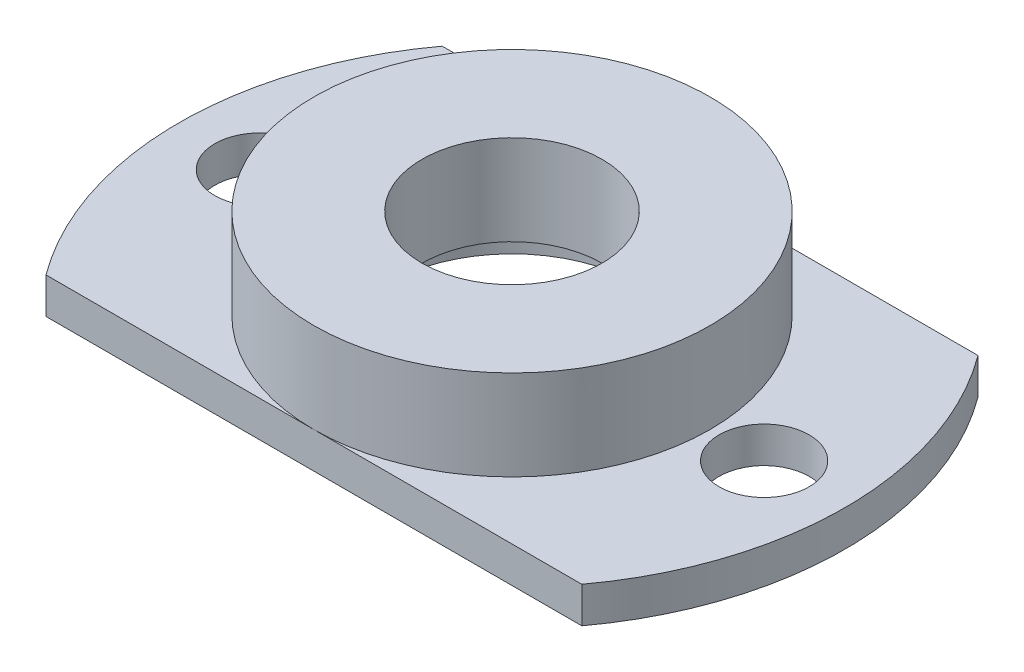
ISO-10303-21;
HEADER;
FILE_DESCRIPTION(('STEP AP214'),'2;1');
FILE_NAME('part.step','',(''),(''),'','','');
FILE_SCHEMA(('AUTOMOTIVE_DESIGN { 1 0 10303 214 1 1 1 1 }'));
ENDSEC;
DATA;
#1=APPLICATION_CONTEXT('core data for automotive mechanical design processes');
#2=APPLICATION_PROTOCOL_DEFINITION('international standard','automotive_design',2000,#1);
#3=PRODUCT_CONTEXT('',#1,'mechanical');
#4=PRODUCT('Part','Part','',(#3));
#5=PRODUCT_RELATED_PRODUCT_CATEGORY('part','',(#4));
#6=PRODUCT_DEFINITION_FORMATION('','',#4);
#7=PRODUCT_DEFINITION_CONTEXT('part definition',#1,'design');
#8=PRODUCT_DEFINITION('design','',#6,#7);
#9=PRODUCT_DEFINITION_SHAPE('','',#8);
#10=(LENGTH_UNIT() NAMED_UNIT(*) SI_UNIT(.MILLI.,.METRE.));
#11=(NAMED_UNIT(*) PLANE_ANGLE_UNIT() SI_UNIT($,.RADIAN.));
#12=(NAMED_UNIT(*) SI_UNIT($,.STERADIAN.) SOLID_ANGLE_UNIT());
#13=UNCERTAINTY_MEASURE_WITH_UNIT(LENGTH_MEASURE(1.E-05),#10,'distance_accuracy_value','');
#14=(GEOMETRIC_REPRESENTATION_CONTEXT(3) GLOBAL_UNCERTAINTY_ASSIGNED_CONTEXT((#13)) GLOBAL_UNIT_ASSIGNED_CONTEXT((#10,
#11,#12)) REPRESENTATION_CONTEXT('',''));
#15=CARTESIAN_POINT('',(0.,0.,0.));
#16=DIRECTION('',(0.,0.,1.));
#17=DIRECTION('',(1.,0.,0.));
#18=AXIS2_PLACEMENT_3D('',#15,#16,#17);
#19=CARTESIAN_POINT('',(0.,2.,0.));
#20=DIRECTION('',(0.,-1.,0.));
#21=DIRECTION('',(0.,0.,-1.));
#22=AXIS2_PLACEMENT_3D('',#19,#20,#21);
#23=CYLINDRICAL_SURFACE('',#22,5.);
#24=CARTESIAN_POINT('',(0.,7.,0.));
#25=DIRECTION('',(0.,1.,0.));
#26=DIRECTION('',(0.,0.,1.));
#27=AXIS2_PLACEMENT_3D('',#24,#25,#26);
#28=CIRCLE('',#27,5.);
#29=CARTESIAN_POINT('',(0.,7.,5.));
#30=VERTEX_POINT('',#29);
#31=EDGE_CURVE('E108',#30,#30,#28,.T.);
#32=ORIENTED_EDGE('',*,*,#31,.T.);
#33=EDGE_LOOP('',(#32));
#34=FACE_BOUND('',#33,.T.);
#35=CARTESIAN_POINT('',(0.,2.,0.));
#36=DIRECTION('',(0.,-1.,0.));
#37=DIRECTION('',(0.,0.,-1.));
#38=AXIS2_PLACEMENT_3D('',#35,#36,#37);
#39=CIRCLE('',#38,5.);
#40=CARTESIAN_POINT('',(0.,2.,-5.));
#41=VERTEX_POINT('',#40);
#42=EDGE_CURVE('E38',#41,#41,#39,.T.);
#43=ORIENTED_EDGE('',*,*,#42,.T.);
#44=EDGE_LOOP('',(#43));
#45=FACE_BOUND('',#44,.T.);
#46=ADVANCED_FACE('F34',(#34,#45),#23,.F.);
#47=CARTESIAN_POINT('',(0.,2.,0.));
#48=DIRECTION('',(0.,1.,0.));
#49=DIRECTION('',(0.,0.,1.));
#50=AXIS2_PLACEMENT_3D('',#47,#48,#49);
#51=PLANE('',#50);
#52=CARTESIAN_POINT('',(14.,2.,0.));
#53=DIRECTION('',(0.,1.,0.));
#54=DIRECTION('',(0.,0.,1.));
#55=AXIS2_PLACEMENT_3D('',#52,#53,#54);
#56=CIRCLE('',#55,2.5);
#57=CARTESIAN_POINT('',(14.,2.,2.5));
#58=VERTEX_POINT('',#57);
#59=EDGE_CURVE('E185',#58,#58,#56,.T.);
#60=ORIENTED_EDGE('',*,*,#59,.F.);
#61=EDGE_LOOP('',(#60));
#62=FACE_BOUND('',#61,.T.);
#63=CARTESIAN_POINT('',(0.,2.,0.));
#64=DIRECTION('',(0.,1.,0.));
#65=DIRECTION('',(0.,0.,1.));
#66=AXIS2_PLACEMENT_3D('',#63,#64,#65);
#67=CIRCLE('',#66,11.);
#68=CARTESIAN_POINT('',(0.,2.,11.));
#69=VERTEX_POINT('',#68);
#70=CARTESIAN_POINT('',(0.,2.,-11.));
#71=VERTEX_POINT('',#70);
#72=EDGE_CURVE('E45',#69,#71,#67,.T.);
#73=ORIENTED_EDGE('',*,*,#72,.F.);
#74=DIRECTION('',(1.,0.,0.));
#75=VECTOR('',#74,1.);
#76=CARTESIAN_POINT('',(-14.8744747806435,2.,11.));
#77=LINE('',#76,#75);
#78=CARTESIAN_POINT('',(14.8744747806435,2.,11.));
#79=VERTEX_POINT('',#78);
#80=EDGE_CURVE('E92',#69,#79,#77,.T.);
#81=ORIENTED_EDGE('',*,*,#80,.T.);
#82=CARTESIAN_POINT('',(0.,2.,0.));
#83=DIRECTION('',(0.,1.,0.));
#84=DIRECTION('',(0.,0.,1.));
#85=AXIS2_PLACEMENT_3D('',#82,#83,#84);
#86=CIRCLE('',#85,18.5);
#87=CARTESIAN_POINT('',(14.8744747806435,2.,-11.));
#88=VERTEX_POINT('',#87);
#89=EDGE_CURVE('E91',#79,#88,#86,.T.);
#90=ORIENTED_EDGE('',*,*,#89,.T.);
#91=DIRECTION('',(-1.,0.,0.));
#92=VECTOR('',#91,1.);
#93=CARTESIAN_POINT('',(-14.8744747806435,2.,-11.));
#94=LINE('',#93,#92);
#95=EDGE_CURVE('E105',#88,#71,#94,.T.);
#96=ORIENTED_EDGE('',*,*,#95,.T.);
#97=EDGE_LOOP('',(#73,#81,#90,#96));
#98=FACE_BOUND('',#97,.T.);
#99=ADVANCED_FACE('F103',(#62,#98),#51,.T.);
#100=CARTESIAN_POINT('',(-14.,2.,0.));
#101=DIRECTION('',(0.,1.,0.));
#102=DIRECTION('',(0.,0.,1.));
#103=AXIS2_PLACEMENT_3D('',#100,#101,#102);
#104=CIRCLE('',#103,2.5);
#105=CARTESIAN_POINT('',(-14.,2.,2.5));
#106=VERTEX_POINT('',#105);
#107=EDGE_CURVE('E179',#106,#106,#104,.T.);
#108=ORIENTED_EDGE('',*,*,#107,.F.);
#109=EDGE_LOOP('',(#108));
#110=FACE_BOUND('',#109,.T.);
#111=EDGE_CURVE('E11',#71,#69,#67,.T.);
#112=ORIENTED_EDGE('',*,*,#111,.F.);
#113=CARTESIAN_POINT('',(-14.8744747806435,2.,-11.));
#114=VERTEX_POINT('',#113);
#115=EDGE_CURVE('E55',#71,#114,#94,.T.);
#116=ORIENTED_EDGE('',*,*,#115,.T.);
#117=CARTESIAN_POINT('',(0.,2.,0.));
#118=DIRECTION('',(0.,1.,0.));
#119=DIRECTION('',(0.,0.,1.));
#120=AXIS2_PLACEMENT_3D('',#117,#118,#119);
#121=CIRCLE('',#120,18.5);
#122=CARTESIAN_POINT('',(-14.8744747806435,2.,11.));
#123=VERTEX_POINT('',#122);
#124=EDGE_CURVE('E89',#114,#123,#121,.T.);
#125=ORIENTED_EDGE('',*,*,#124,.T.);
#126=EDGE_CURVE('E84',#123,#69,#77,.T.);
#127=ORIENTED_EDGE('',*,*,#126,.T.);
#128=EDGE_LOOP('',(#112,#116,#125,#127));
#129=FACE_BOUND('',#128,.T.);
#130=ADVANCED_FACE('F87',(#110,#129),#51,.T.);
#131=CARTESIAN_POINT('',(0.,0.,0.));
#132=DIRECTION('',(0.,1.,0.));
#133=DIRECTION('',(0.,0.,1.));
#134=AXIS2_PLACEMENT_3D('',#131,#132,#133);
#135=PLANE('',#134);
#136=CARTESIAN_POINT('',(0.,0.,0.));
#137=DIRECTION('',(0.,-1.,0.));
#138=DIRECTION('',(0.,0.,-1.));
#139=AXIS2_PLACEMENT_3D('',#136,#137,#138);
#140=CIRCLE('',#139,7.);
#141=CARTESIAN_POINT('',(0.,0.,-7.));
#142=VERTEX_POINT('',#141);
#143=EDGE_CURVE('E191',#142,#142,#140,.T.);
#144=ORIENTED_EDGE('',*,*,#143,.F.);
#145=EDGE_LOOP('',(#144));
#146=FACE_BOUND('',#145,.T.);
#147=CARTESIAN_POINT('',(14.,0.,0.));
#148=DIRECTION('',(0.,-1.,0.));
#149=DIRECTION('',(0.,0.,-1.));
#150=AXIS2_PLACEMENT_3D('',#147,#148,#149);
#151=CIRCLE('',#150,2.5);
#152=CARTESIAN_POINT('',(14.,0.,-2.5));
#153=VERTEX_POINT('',#152);
#154=EDGE_CURVE('E188',#153,#153,#151,.T.);
#155=ORIENTED_EDGE('',*,*,#154,.F.);
#156=EDGE_LOOP('',(#155));
#157=FACE_BOUND('',#156,.T.);
#158=CARTESIAN_POINT('',(-14.,0.,0.));
#159=DIRECTION('',(0.,-1.,0.));
#160=DIRECTION('',(0.,0.,-1.));
#161=AXIS2_PLACEMENT_3D('',#158,#159,#160);
#162=CIRCLE('',#161,2.5);
#163=CARTESIAN_POINT('',(-14.,0.,-2.5));
#164=VERTEX_POINT('',#163);
#165=EDGE_CURVE('E182',#164,#164,#162,.T.);
#166=ORIENTED_EDGE('',*,*,#165,.F.);
#167=EDGE_LOOP('',(#166));
#168=FACE_BOUND('',#167,.T.);
#169=CARTESIAN_POINT('',(0.,0.,0.));
#170=DIRECTION('',(0.,1.,0.));
#171=DIRECTION('',(0.,0.,1.));
#172=AXIS2_PLACEMENT_3D('',#169,#170,#171);
#173=CIRCLE('',#172,18.5);
#174=CARTESIAN_POINT('',(-14.8744747806435,0.,-11.));
#175=VERTEX_POINT('',#174);
#176=CARTESIAN_POINT('',(-14.8744747806435,0.,11.));
#177=VERTEX_POINT('',#176);
#178=EDGE_CURVE('E157',#175,#177,#173,.T.);
#179=ORIENTED_EDGE('',*,*,#178,.F.);
#180=DIRECTION('',(-1.,0.,0.));
#181=VECTOR('',#180,1.);
#182=CARTESIAN_POINT('',(-14.8744747806435,0.,-11.));
#183=LINE('',#182,#181);
#184=CARTESIAN_POINT('',(14.8744747806435,0.,-11.));
#185=VERTEX_POINT('',#184);
#186=EDGE_CURVE('E77',#185,#175,#183,.T.);
#187=ORIENTED_EDGE('',*,*,#186,.F.);
#188=CARTESIAN_POINT('',(0.,0.,0.));
#189=DIRECTION('',(0.,1.,0.));
#190=DIRECTION('',(0.,0.,1.));
#191=AXIS2_PLACEMENT_3D('',#188,#189,#190);
#192=CIRCLE('',#191,18.5);
#193=CARTESIAN_POINT('',(14.8744747806435,0.,11.));
#194=VERTEX_POINT('',#193);
#195=EDGE_CURVE('E162',#194,#185,#192,.T.);
#196=ORIENTED_EDGE('',*,*,#195,.F.);
#197=DIRECTION('',(1.,0.,0.));
#198=VECTOR('',#197,1.);
#199=CARTESIAN_POINT('',(-14.8744747806435,0.,11.));
#200=LINE('',#199,#198);
#201=EDGE_CURVE('E160',#177,#194,#200,.T.);
#202=ORIENTED_EDGE('',*,*,#201,.F.);
#203=EDGE_LOOP('',(#179,#187,#196,#202));
#204=FACE_BOUND('',#203,.T.);
#205=ADVANCED_FACE('F138',(#146,#157,#168,#204),#135,.F.);
#206=CARTESIAN_POINT('',(0.,2.,0.));
#207=DIRECTION('',(0.,-1.,0.));
#208=DIRECTION('',(0.,0.,-1.));
#209=AXIS2_PLACEMENT_3D('',#206,#207,#208);
#210=CYLINDRICAL_SURFACE('',#209,18.5);
#211=ORIENTED_EDGE('',*,*,#178,.T.);
#212=DIRECTION('',(0.,-1.,0.));
#213=VECTOR('',#212,1.);
#214=CARTESIAN_POINT('',(-14.8744747806435,2.,11.));
#215=LINE('',#214,#213);
#216=EDGE_CURVE('E43',#123,#177,#215,.T.);
#217=ORIENTED_EDGE('',*,*,#216,.F.);
#218=ORIENTED_EDGE('',*,*,#124,.F.);
#219=DIRECTION('',(0.,-1.,0.));
#220=VECTOR('',#219,1.);
#221=CARTESIAN_POINT('',(-14.8744747806435,2.,-11.));
#222=LINE('',#221,#220);
#223=EDGE_CURVE('E158',#114,#175,#222,.T.);
#224=ORIENTED_EDGE('',*,*,#223,.T.);
#225=EDGE_LOOP('',(#211,#217,#218,#224));
#226=FACE_BOUND('',#225,.T.);
#227=ADVANCED_FACE('F36',(#226),#210,.T.);
#228=CARTESIAN_POINT('',(-14.8744747806435,2.,11.));
#229=DIRECTION('',(0.,0.,-1.));
#230=DIRECTION('',(-1.,0.,0.));
#231=AXIS2_PLACEMENT_3D('',#228,#229,#230);
#232=PLANE('',#231);
#233=ORIENTED_EDGE('',*,*,#201,.T.);
#234=DIRECTION('',(0.,-1.,0.));
#235=VECTOR('',#234,1.);
#236=CARTESIAN_POINT('',(14.8744747806435,2.,11.));
#237=LINE('',#236,#235);
#238=EDGE_CURVE('E98',#79,#194,#237,.T.);
#239=ORIENTED_EDGE('',*,*,#238,.F.);
#240=ORIENTED_EDGE('',*,*,#80,.F.);
#241=ORIENTED_EDGE('',*,*,#126,.F.);
#242=ORIENTED_EDGE('',*,*,#216,.T.);
#243=EDGE_LOOP('',(#233,#239,#240,#241,#242));
#244=FACE_BOUND('',#243,.T.);
#245=ADVANCED_FACE('F96',(#244),#232,.F.);
#246=CARTESIAN_POINT('',(0.,2.,0.));
#247=DIRECTION('',(0.,-1.,0.));
#248=DIRECTION('',(0.,0.,-1.));
#249=AXIS2_PLACEMENT_3D('',#246,#247,#248);
#250=CYLINDRICAL_SURFACE('',#249,18.5);
#251=ORIENTED_EDGE('',*,*,#195,.T.);
#252=DIRECTION('',(0.,-1.,0.));
#253=VECTOR('',#252,1.);
#254=CARTESIAN_POINT('',(14.8744747806435,2.,-11.));
#255=LINE('',#254,#253);
#256=EDGE_CURVE('E172',#88,#185,#255,.T.);
#257=ORIENTED_EDGE('',*,*,#256,.F.);
#258=ORIENTED_EDGE('',*,*,#89,.F.);
#259=ORIENTED_EDGE('',*,*,#238,.T.);
#260=EDGE_LOOP('',(#251,#257,#258,#259));
#261=FACE_BOUND('',#260,.T.);
#262=ADVANCED_FACE('F145',(#261),#250,.T.);
#263=CARTESIAN_POINT('',(-14.8744747806435,2.,-11.));
#264=DIRECTION('',(0.,0.,1.));
#265=DIRECTION('',(1.,0.,0.));
#266=AXIS2_PLACEMENT_3D('',#263,#264,#265);
#267=PLANE('',#266);
#268=ORIENTED_EDGE('',*,*,#186,.T.);
#269=ORIENTED_EDGE('',*,*,#223,.F.);
#270=ORIENTED_EDGE('',*,*,#115,.F.);
#271=ORIENTED_EDGE('',*,*,#95,.F.);
#272=ORIENTED_EDGE('',*,*,#256,.T.);
#273=EDGE_LOOP('',(#268,#269,#270,#271,#272));
#274=FACE_BOUND('',#273,.T.);
#275=ADVANCED_FACE('F122',(#274),#267,.F.);
#276=CARTESIAN_POINT('',(0.,7.,0.));
#277=DIRECTION('',(0.,1.,0.));
#278=DIRECTION('',(0.,0.,1.));
#279=AXIS2_PLACEMENT_3D('',#276,#277,#278);
#280=PLANE('',#279);
#281=CARTESIAN_POINT('',(0.,7.,0.));
#282=DIRECTION('',(0.,1.,0.));
#283=DIRECTION('',(0.,0.,1.));
#284=AXIS2_PLACEMENT_3D('',#281,#282,#283);
#285=CIRCLE('',#284,11.);
#286=CARTESIAN_POINT('',(0.,7.,11.));
#287=VERTEX_POINT('',#286);
#288=EDGE_CURVE('E107',#287,#287,#285,.T.);
#289=ORIENTED_EDGE('',*,*,#288,.T.);
#290=EDGE_LOOP('',(#289));
#291=FACE_BOUND('',#290,.T.);
#292=ORIENTED_EDGE('',*,*,#31,.F.);
#293=EDGE_LOOP('',(#292));
#294=FACE_BOUND('',#293,.T.);
#295=ADVANCED_FACE('F112',(#291,#294),#280,.T.);
#296=CARTESIAN_POINT('',(0.,7.,0.));
#297=DIRECTION('',(0.,-1.,0.));
#298=DIRECTION('',(0.,0.,-1.));
#299=AXIS2_PLACEMENT_3D('',#296,#297,#298);
#300=CYLINDRICAL_SURFACE('',#299,11.);
#301=ORIENTED_EDGE('',*,*,#288,.F.);
#302=EDGE_LOOP('',(#301));
#303=FACE_BOUND('',#302,.T.);
#304=ORIENTED_EDGE('',*,*,#72,.T.);
#305=ORIENTED_EDGE('',*,*,#111,.T.);
#306=EDGE_LOOP('',(#304,#305));
#307=FACE_BOUND('',#306,.T.);
#308=ADVANCED_FACE('F109',(#303,#307),#300,.T.);
#309=CARTESIAN_POINT('',(-14.,7.,0.));
#310=DIRECTION('',(0.,-1.,0.));
#311=DIRECTION('',(0.,0.,-1.));
#312=AXIS2_PLACEMENT_3D('',#309,#310,#311);
#313=CYLINDRICAL_SURFACE('',#312,2.5);
#314=ORIENTED_EDGE('',*,*,#107,.T.);
#315=EDGE_LOOP('',(#314));
#316=FACE_BOUND('',#315,.T.);
#317=ORIENTED_EDGE('',*,*,#165,.T.);
#318=EDGE_LOOP('',(#317));
#319=FACE_BOUND('',#318,.T.);
#320=ADVANCED_FACE('F111',(#316,#319),#313,.F.);
#321=CARTESIAN_POINT('',(14.,7.,0.));
#322=DIRECTION('',(0.,-1.,0.));
#323=DIRECTION('',(0.,0.,-1.));
#324=AXIS2_PLACEMENT_3D('',#321,#322,#323);
#325=CYLINDRICAL_SURFACE('',#324,2.5);
#326=ORIENTED_EDGE('',*,*,#59,.T.);
#327=EDGE_LOOP('',(#326));
#328=FACE_BOUND('',#327,.T.);
#329=ORIENTED_EDGE('',*,*,#154,.T.);
#330=EDGE_LOOP('',(#329));
#331=FACE_BOUND('',#330,.T.);
#332=ADVANCED_FACE('F119',(#328,#331),#325,.F.);
#333=CARTESIAN_POINT('',(0.,2.,0.));
#334=DIRECTION('',(0.,-1.,0.));
#335=DIRECTION('',(0.,0.,-1.));
#336=AXIS2_PLACEMENT_3D('',#333,#334,#335);
#337=CYLINDRICAL_SURFACE('',#336,7.);
#338=CARTESIAN_POINT('',(0.,2.,0.));
#339=DIRECTION('',(0.,-1.,0.));
#340=DIRECTION('',(0.,0.,-1.));
#341=AXIS2_PLACEMENT_3D('',#338,#339,#340);
#342=CIRCLE('',#341,7.);
#343=CARTESIAN_POINT('',(0.,2.,-7.));
#344=VERTEX_POINT('',#343);
#345=EDGE_CURVE('E194',#344,#344,#342,.T.);
#346=ORIENTED_EDGE('',*,*,#345,.F.);
#347=EDGE_LOOP('',(#346));
#348=FACE_BOUND('',#347,.T.);
#349=ORIENTED_EDGE('',*,*,#143,.T.);
#350=EDGE_LOOP('',(#349));
#351=FACE_BOUND('',#350,.T.);
#352=ADVANCED_FACE('F203',(#348,#351),#337,.F.);
#353=CARTESIAN_POINT('',(0.,2.,0.));
#354=DIRECTION('',(0.,-1.,0.));
#355=DIRECTION('',(0.,0.,-1.));
#356=AXIS2_PLACEMENT_3D('',#353,#354,#355);
#357=PLANE('',#356);
#358=ORIENTED_EDGE('',*,*,#42,.F.);
#359=EDGE_LOOP('',(#358));
#360=FACE_BOUND('',#359,.T.);
#361=ORIENTED_EDGE('',*,*,#345,.T.);
#362=EDGE_LOOP('',(#361));
#363=FACE_BOUND('',#362,.T.);
#364=ADVANCED_FACE('F201',(#360,#363),#357,.T.);
#365=CLOSED_SHELL('',(#46,#99,#130,#205,#227,#245,#262,#275,#295,#308,#320,#332,#352,#364));
#366=MANIFOLD_SOLID_BREP('B2',#365);
#367=ADVANCED_BREP_SHAPE_REPRESENTATION('',(#18,#366),#14);
#368=SHAPE_DEFINITION_REPRESENTATION(#9,#367);
ENDSEC;
END-ISO-10303-21;
